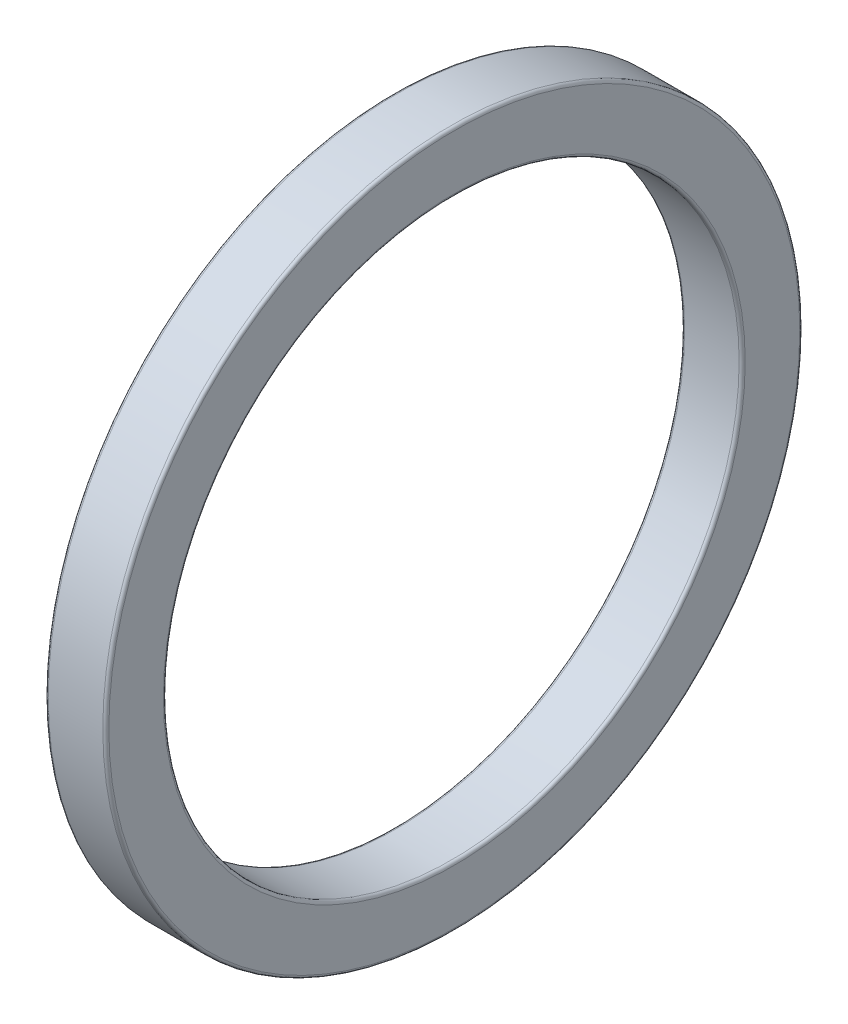
ISO-10303-21;
HEADER;
FILE_DESCRIPTION(('STEP AP214'),'2;1');
FILE_NAME('part.step','',(''),(''),'','','');
FILE_SCHEMA(('AUTOMOTIVE_DESIGN { 1 0 10303 214 1 1 1 1 }'));
ENDSEC;
DATA;
#1=APPLICATION_CONTEXT('core data for automotive mechanical design processes');
#2=APPLICATION_PROTOCOL_DEFINITION('international standard','automotive_design',2000,#1);
#3=PRODUCT_CONTEXT('',#1,'mechanical');
#4=PRODUCT('Part','Part','',(#3));
#5=PRODUCT_RELATED_PRODUCT_CATEGORY('part','',(#4));
#6=PRODUCT_DEFINITION_FORMATION('','',#4);
#7=PRODUCT_DEFINITION_CONTEXT('part definition',#1,'design');
#8=PRODUCT_DEFINITION('design','',#6,#7);
#9=PRODUCT_DEFINITION_SHAPE('','',#8);
#10=(LENGTH_UNIT() NAMED_UNIT(*) SI_UNIT(.MILLI.,.METRE.));
#11=(NAMED_UNIT(*) PLANE_ANGLE_UNIT() SI_UNIT($,.RADIAN.));
#12=(NAMED_UNIT(*) SI_UNIT($,.STERADIAN.) SOLID_ANGLE_UNIT());
#13=UNCERTAINTY_MEASURE_WITH_UNIT(LENGTH_MEASURE(1.E-05),#10,'distance_accuracy_value','');
#14=(GEOMETRIC_REPRESENTATION_CONTEXT(3) GLOBAL_UNCERTAINTY_ASSIGNED_CONTEXT((#13)) GLOBAL_UNIT_ASSIGNED_CONTEXT((#10,
#11,#12)) REPRESENTATION_CONTEXT('',''));
#15=CARTESIAN_POINT('',(0.,0.,0.));
#16=DIRECTION('',(0.,0.,1.));
#17=DIRECTION('',(1.,0.,0.));
#18=AXIS2_PLACEMENT_3D('',#15,#16,#17);
#19=CARTESIAN_POINT('',(0.,11.5,0.));
#20=DIRECTION('',(-1.,0.,0.));
#21=DIRECTION('',(0.,0.,1.));
#22=AXIS2_PLACEMENT_3D('',#19,#20,#21);
#23=PLANE('',#22);
#24=CARTESIAN_POINT('',(0.,0.,0.));
#25=DIRECTION('',(-1.,0.,0.));
#26=DIRECTION('',(0.,0.,1.));
#27=AXIS2_PLACEMENT_3D('',#24,#25,#26);
#28=CIRCLE('',#27,9.6);
#29=CARTESIAN_POINT('',(0.,0.,9.6));
#30=VERTEX_POINT('',#29);
#31=EDGE_CURVE('E10',#30,#30,#28,.T.);
#32=ORIENTED_EDGE('',*,*,#31,.T.);
#33=EDGE_LOOP('',(#32));
#34=FACE_BOUND('',#33,.T.);
#35=CARTESIAN_POINT('',(0.,0.,0.));
#36=DIRECTION('',(-1.,0.,0.));
#37=DIRECTION('',(0.,0.,1.));
#38=AXIS2_PLACEMENT_3D('',#35,#36,#37);
#39=CIRCLE('',#38,11.4);
#40=CARTESIAN_POINT('',(0.,0.,11.4));
#41=VERTEX_POINT('',#40);
#42=EDGE_CURVE('E42',#41,#41,#39,.F.);
#43=ORIENTED_EDGE('',*,*,#42,.T.);
#44=EDGE_LOOP('',(#43));
#45=FACE_BOUND('',#44,.T.);
#46=ADVANCED_FACE('F35',(#34,#45),#23,.F.);
#47=CARTESIAN_POINT('',(-16.5757575757576,0.,0.));
#48=DIRECTION('',(-1.,0.,0.));
#49=DIRECTION('',(0.,0.,1.));
#50=AXIS2_PLACEMENT_3D('',#47,#48,#49);
#51=CYLINDRICAL_SURFACE('',#50,9.5);
#52=CARTESIAN_POINT('',(-1.9,0.,0.));
#53=DIRECTION('',(1.,0.,0.));
#54=DIRECTION('',(0.,0.,-1.));
#55=AXIS2_PLACEMENT_3D('',#52,#53,#54);
#56=CIRCLE('',#55,9.5);
#57=CARTESIAN_POINT('',(-1.9,0.,-9.5));
#58=VERTEX_POINT('',#57);
#59=EDGE_CURVE('E46',#58,#58,#56,.F.);
#60=ORIENTED_EDGE('',*,*,#59,.T.);
#61=EDGE_LOOP('',(#60));
#62=FACE_BOUND('',#61,.T.);
#63=CARTESIAN_POINT('',(-0.0999999999999994,0.,0.));
#64=DIRECTION('',(-1.,0.,0.));
#65=DIRECTION('',(0.,0.,1.));
#66=AXIS2_PLACEMENT_3D('',#63,#64,#65);
#67=CIRCLE('',#66,9.5);
#68=CARTESIAN_POINT('',(-0.0999999999999994,0.,9.5));
#69=VERTEX_POINT('',#68);
#70=EDGE_CURVE('E50',#69,#69,#67,.F.);
#71=ORIENTED_EDGE('',*,*,#70,.T.);
#72=EDGE_LOOP('',(#71));
#73=FACE_BOUND('',#72,.T.);
#74=ADVANCED_FACE('F78',(#62,#73),#51,.F.);
#75=CARTESIAN_POINT('',(-2.,9.5,0.));
#76=DIRECTION('',(1.,0.,0.));
#77=DIRECTION('',(0.,0.,-1.));
#78=AXIS2_PLACEMENT_3D('',#75,#76,#77);
#79=PLANE('',#78);
#80=CARTESIAN_POINT('',(-2.,0.,0.));
#81=DIRECTION('',(1.,0.,0.));
#82=DIRECTION('',(0.,0.,-1.));
#83=AXIS2_PLACEMENT_3D('',#80,#81,#82);
#84=CIRCLE('',#83,11.4);
#85=CARTESIAN_POINT('',(-2.,0.,-11.4));
#86=VERTEX_POINT('',#85);
#87=EDGE_CURVE('E61',#86,#86,#84,.F.);
#88=ORIENTED_EDGE('',*,*,#87,.T.);
#89=EDGE_LOOP('',(#88));
#90=FACE_BOUND('',#89,.T.);
#91=CARTESIAN_POINT('',(-2.,0.,0.));
#92=DIRECTION('',(1.,0.,0.));
#93=DIRECTION('',(0.,0.,-1.));
#94=AXIS2_PLACEMENT_3D('',#91,#92,#93);
#95=CIRCLE('',#94,9.6);
#96=CARTESIAN_POINT('',(-2.,0.,-9.6));
#97=VERTEX_POINT('',#96);
#98=EDGE_CURVE('E64',#97,#97,#95,.T.);
#99=ORIENTED_EDGE('',*,*,#98,.T.);
#100=EDGE_LOOP('',(#99));
#101=FACE_BOUND('',#100,.T.);
#102=ADVANCED_FACE('F68',(#90,#101),#79,.F.);
#103=CARTESIAN_POINT('',(-16.5757575757576,0.,0.));
#104=DIRECTION('',(-1.,0.,0.));
#105=DIRECTION('',(0.,0.,1.));
#106=AXIS2_PLACEMENT_3D('',#103,#104,#105);
#107=CYLINDRICAL_SURFACE('',#106,11.5);
#108=CARTESIAN_POINT('',(-1.9,0.,0.));
#109=DIRECTION('',(1.,0.,0.));
#110=DIRECTION('',(0.,0.,-1.));
#111=AXIS2_PLACEMENT_3D('',#108,#109,#110);
#112=CIRCLE('',#111,11.5);
#113=CARTESIAN_POINT('',(-1.9,0.,-11.5));
#114=VERTEX_POINT('',#113);
#115=EDGE_CURVE('E55',#114,#114,#112,.T.);
#116=ORIENTED_EDGE('',*,*,#115,.T.);
#117=EDGE_LOOP('',(#116));
#118=FACE_BOUND('',#117,.T.);
#119=CARTESIAN_POINT('',(-0.0999999999999994,0.,0.));
#120=DIRECTION('',(-1.,0.,0.));
#121=DIRECTION('',(0.,0.,1.));
#122=AXIS2_PLACEMENT_3D('',#119,#120,#121);
#123=CIRCLE('',#122,11.5);
#124=CARTESIAN_POINT('',(-0.0999999999999994,0.,11.5));
#125=VERTEX_POINT('',#124);
#126=EDGE_CURVE('E58',#125,#125,#123,.T.);
#127=ORIENTED_EDGE('',*,*,#126,.T.);
#128=EDGE_LOOP('',(#127));
#129=FACE_BOUND('',#128,.T.);
#130=ADVANCED_FACE('F97',(#118,#129),#107,.T.);
#131=CARTESIAN_POINT('',(-1.9,0.,0.));
#132=DIRECTION('',(1.,0.,0.));
#133=DIRECTION('',(0.,0.,-1.));
#134=AXIS2_PLACEMENT_3D('',#131,#132,#133);
#135=TOROIDAL_SURFACE('',#134,11.4,0.1);
#136=ORIENTED_EDGE('',*,*,#115,.F.);
#137=EDGE_LOOP('',(#136));
#138=FACE_BOUND('',#137,.T.);
#139=ORIENTED_EDGE('',*,*,#87,.F.);
#140=EDGE_LOOP('',(#139));
#141=FACE_BOUND('',#140,.T.);
#142=ADVANCED_FACE('F74',(#138,#141),#135,.T.);
#143=CARTESIAN_POINT('',(-1.9,0.,0.));
#144=DIRECTION('',(1.,0.,0.));
#145=DIRECTION('',(0.,0.,-1.));
#146=AXIS2_PLACEMENT_3D('',#143,#144,#145);
#147=TOROIDAL_SURFACE('',#146,9.6,0.1);
#148=ORIENTED_EDGE('',*,*,#98,.F.);
#149=EDGE_LOOP('',(#148));
#150=FACE_BOUND('',#149,.T.);
#151=ORIENTED_EDGE('',*,*,#59,.F.);
#152=EDGE_LOOP('',(#151));
#153=FACE_BOUND('',#152,.T.);
#154=ADVANCED_FACE('F70',(#150,#153),#147,.T.);
#155=CARTESIAN_POINT('',(-0.0999999999999994,0.,0.));
#156=DIRECTION('',(-1.,0.,0.));
#157=DIRECTION('',(0.,0.,1.));
#158=AXIS2_PLACEMENT_3D('',#155,#156,#157);
#159=TOROIDAL_SURFACE('',#158,9.6,0.1);
#160=ORIENTED_EDGE('',*,*,#70,.F.);
#161=EDGE_LOOP('',(#160));
#162=FACE_BOUND('',#161,.T.);
#163=ORIENTED_EDGE('',*,*,#31,.F.);
#164=EDGE_LOOP('',(#163));
#165=FACE_BOUND('',#164,.T.);
#166=ADVANCED_FACE('F73',(#162,#165),#159,.T.);
#167=CARTESIAN_POINT('',(-0.0999999999999994,0.,0.));
#168=DIRECTION('',(-1.,0.,0.));
#169=DIRECTION('',(0.,0.,1.));
#170=AXIS2_PLACEMENT_3D('',#167,#168,#169);
#171=TOROIDAL_SURFACE('',#170,11.4,0.1);
#172=ORIENTED_EDGE('',*,*,#42,.F.);
#173=EDGE_LOOP('',(#172));
#174=FACE_BOUND('',#173,.T.);
#175=ORIENTED_EDGE('',*,*,#126,.F.);
#176=EDGE_LOOP('',(#175));
#177=FACE_BOUND('',#176,.T.);
#178=ADVANCED_FACE('F37',(#174,#177),#171,.T.);
#179=CLOSED_SHELL('',(#46,#74,#102,#130,#142,#154,#166,#178));
#180=MANIFOLD_SOLID_BREP('B2',#179);
#181=ADVANCED_BREP_SHAPE_REPRESENTATION('',(#18,#180),#14);
#182=SHAPE_DEFINITION_REPRESENTATION(#9,#181);
ENDSEC;
END-ISO-10303-21;
